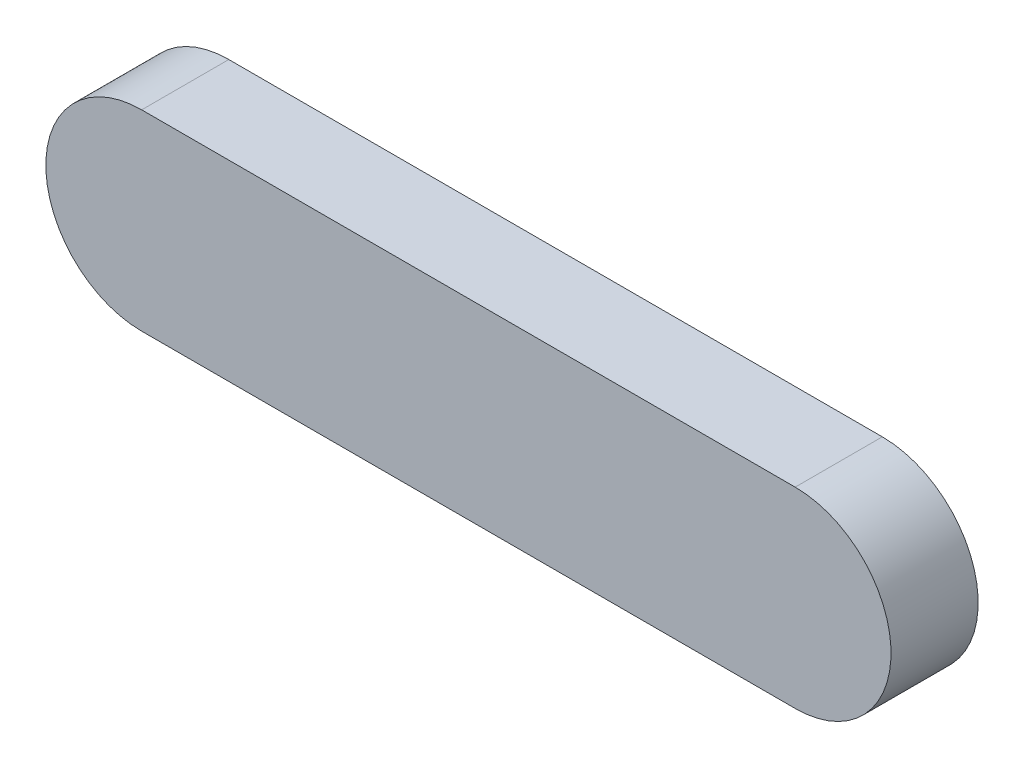
ISO-10303-21;
HEADER;
FILE_DESCRIPTION(('STEP AP214'),'2;1');
FILE_NAME('part.step','',(''),(''),'','','');
FILE_SCHEMA(('AUTOMOTIVE_DESIGN { 1 0 10303 214 1 1 1 1 }'));
ENDSEC;
DATA;
#1=APPLICATION_CONTEXT('core data for automotive mechanical design processes');
#2=APPLICATION_PROTOCOL_DEFINITION('international standard','automotive_design',2000,#1);
#3=PRODUCT_CONTEXT('',#1,'mechanical');
#4=PRODUCT('Part','Part','',(#3));
#5=PRODUCT_RELATED_PRODUCT_CATEGORY('part','',(#4));
#6=PRODUCT_DEFINITION_FORMATION('','',#4);
#7=PRODUCT_DEFINITION_CONTEXT('part definition',#1,'design');
#8=PRODUCT_DEFINITION('design','',#6,#7);
#9=PRODUCT_DEFINITION_SHAPE('','',#8);
#10=(LENGTH_UNIT() NAMED_UNIT(*) SI_UNIT(.MILLI.,.METRE.));
#11=(NAMED_UNIT(*) PLANE_ANGLE_UNIT() SI_UNIT($,.RADIAN.));
#12=(NAMED_UNIT(*) SI_UNIT($,.STERADIAN.) SOLID_ANGLE_UNIT());
#13=UNCERTAINTY_MEASURE_WITH_UNIT(LENGTH_MEASURE(1.E-05),#10,'distance_accuracy_value','');
#14=(GEOMETRIC_REPRESENTATION_CONTEXT(3) GLOBAL_UNCERTAINTY_ASSIGNED_CONTEXT((#13)) GLOBAL_UNIT_ASSIGNED_CONTEXT((#10,
#11,#12)) REPRESENTATION_CONTEXT('',''));
#15=CARTESIAN_POINT('',(0.,0.,0.));
#16=DIRECTION('',(0.,0.,1.));
#17=DIRECTION('',(1.,0.,0.));
#18=AXIS2_PLACEMENT_3D('',#15,#16,#17);
#19=CARTESIAN_POINT('',(20.,50.,10.));
#20=DIRECTION('',(0.,0.,-1.));
#21=DIRECTION('',(-1.,0.,0.));
#22=AXIS2_PLACEMENT_3D('',#19,#20,#21);
#23=CYLINDRICAL_SURFACE('',#22,11.);
#24=CARTESIAN_POINT('',(20.,50.,0.));
#25=DIRECTION('',(0.,0.,1.));
#26=DIRECTION('',(1.,0.,0.));
#27=AXIS2_PLACEMENT_3D('',#24,#25,#26);
#28=CIRCLE('',#27,11.);
#29=CARTESIAN_POINT('',(20.,61.,0.));
#30=VERTEX_POINT('',#29);
#31=CARTESIAN_POINT('',(20.,39.,0.));
#32=VERTEX_POINT('',#31);
#33=EDGE_CURVE('E104',#30,#32,#28,.T.);
#34=ORIENTED_EDGE('',*,*,#33,.T.);
#35=DIRECTION('',(0.,0.,-1.));
#36=VECTOR('',#35,1.);
#37=CARTESIAN_POINT('',(20.,39.,10.));
#38=LINE('',#37,#36);
#39=CARTESIAN_POINT('',(20.,39.,10.));
#40=VERTEX_POINT('',#39);
#41=EDGE_CURVE('E11',#40,#32,#38,.T.);
#42=ORIENTED_EDGE('',*,*,#41,.F.);
#43=CARTESIAN_POINT('',(20.,50.,10.));
#44=DIRECTION('',(0.,0.,1.));
#45=DIRECTION('',(1.,0.,0.));
#46=AXIS2_PLACEMENT_3D('',#43,#44,#45);
#47=CIRCLE('',#46,11.);
#48=CARTESIAN_POINT('',(20.,61.,10.));
#49=VERTEX_POINT('',#48);
#50=EDGE_CURVE('E92',#49,#40,#47,.T.);
#51=ORIENTED_EDGE('',*,*,#50,.F.);
#52=DIRECTION('',(0.,0.,-1.));
#53=VECTOR('',#52,1.);
#54=CARTESIAN_POINT('',(20.,61.,10.));
#55=LINE('',#54,#53);
#56=EDGE_CURVE('E100',#49,#30,#55,.T.);
#57=ORIENTED_EDGE('',*,*,#56,.T.);
#58=EDGE_LOOP('',(#34,#42,#51,#57));
#59=FACE_BOUND('',#58,.T.);
#60=ADVANCED_FACE('F41',(#59),#23,.T.);
#61=CARTESIAN_POINT('',(20.,39.,10.));
#62=DIRECTION('',(0.,1.,0.));
#63=DIRECTION('',(0.,0.,1.));
#64=AXIS2_PLACEMENT_3D('',#61,#62,#63);
#65=PLANE('',#64);
#66=DIRECTION('',(1.,0.,0.));
#67=VECTOR('',#66,1.);
#68=CARTESIAN_POINT('',(20.,39.,0.));
#69=LINE('',#68,#67);
#70=CARTESIAN_POINT('',(95.,39.,0.));
#71=VERTEX_POINT('',#70);
#72=EDGE_CURVE('E96',#32,#71,#69,.T.);
#73=ORIENTED_EDGE('',*,*,#72,.T.);
#74=DIRECTION('',(0.,0.,-1.));
#75=VECTOR('',#74,1.);
#76=CARTESIAN_POINT('',(95.,39.,10.));
#77=LINE('',#76,#75);
#78=CARTESIAN_POINT('',(95.,39.,10.));
#79=VERTEX_POINT('',#78);
#80=EDGE_CURVE('E49',#79,#71,#77,.T.);
#81=ORIENTED_EDGE('',*,*,#80,.F.);
#82=DIRECTION('',(1.,0.,0.));
#83=VECTOR('',#82,1.);
#84=CARTESIAN_POINT('',(20.,39.,10.));
#85=LINE('',#84,#83);
#86=EDGE_CURVE('E87',#40,#79,#85,.T.);
#87=ORIENTED_EDGE('',*,*,#86,.F.);
#88=ORIENTED_EDGE('',*,*,#41,.T.);
#89=EDGE_LOOP('',(#73,#81,#87,#88));
#90=FACE_BOUND('',#89,.T.);
#91=ADVANCED_FACE('F95',(#90),#65,.F.);
#92=CARTESIAN_POINT('',(95.,50.,10.));
#93=DIRECTION('',(0.,0.,-1.));
#94=DIRECTION('',(-1.,0.,0.));
#95=AXIS2_PLACEMENT_3D('',#92,#93,#94);
#96=CYLINDRICAL_SURFACE('',#95,11.);
#97=CARTESIAN_POINT('',(95.,50.,0.));
#98=DIRECTION('',(0.,0.,1.));
#99=DIRECTION('',(1.,0.,0.));
#100=AXIS2_PLACEMENT_3D('',#97,#98,#99);
#101=CIRCLE('',#100,11.);
#102=CARTESIAN_POINT('',(95.,61.,0.));
#103=VERTEX_POINT('',#102);
#104=EDGE_CURVE('E74',#71,#103,#101,.T.);
#105=ORIENTED_EDGE('',*,*,#104,.T.);
#106=DIRECTION('',(0.,0.,-1.));
#107=VECTOR('',#106,1.);
#108=CARTESIAN_POINT('',(95.,61.,10.));
#109=LINE('',#108,#107);
#110=CARTESIAN_POINT('',(95.,61.,10.));
#111=VERTEX_POINT('',#110);
#112=EDGE_CURVE('E97',#111,#103,#109,.T.);
#113=ORIENTED_EDGE('',*,*,#112,.F.);
#114=CARTESIAN_POINT('',(95.,50.,10.));
#115=DIRECTION('',(0.,0.,1.));
#116=DIRECTION('',(1.,0.,0.));
#117=AXIS2_PLACEMENT_3D('',#114,#115,#116);
#118=CIRCLE('',#117,11.);
#119=EDGE_CURVE('E90',#79,#111,#118,.T.);
#120=ORIENTED_EDGE('',*,*,#119,.F.);
#121=ORIENTED_EDGE('',*,*,#80,.T.);
#122=EDGE_LOOP('',(#105,#113,#120,#121));
#123=FACE_BOUND('',#122,.T.);
#124=ADVANCED_FACE('F98',(#123),#96,.T.);
#125=CARTESIAN_POINT('',(20.,61.,10.));
#126=DIRECTION('',(0.,-1.,0.));
#127=DIRECTION('',(0.,0.,-1.));
#128=AXIS2_PLACEMENT_3D('',#125,#126,#127);
#129=PLANE('',#128);
#130=DIRECTION('',(-1.,0.,0.));
#131=VECTOR('',#130,1.);
#132=CARTESIAN_POINT('',(20.,61.,0.));
#133=LINE('',#132,#131);
#134=EDGE_CURVE('E80',#103,#30,#133,.T.);
#135=ORIENTED_EDGE('',*,*,#134,.T.);
#136=ORIENTED_EDGE('',*,*,#56,.F.);
#137=DIRECTION('',(-1.,0.,0.));
#138=VECTOR('',#137,1.);
#139=CARTESIAN_POINT('',(20.,61.,10.));
#140=LINE('',#139,#138);
#141=EDGE_CURVE('E57',#111,#49,#140,.T.);
#142=ORIENTED_EDGE('',*,*,#141,.F.);
#143=ORIENTED_EDGE('',*,*,#112,.T.);
#144=EDGE_LOOP('',(#135,#136,#142,#143));
#145=FACE_BOUND('',#144,.T.);
#146=ADVANCED_FACE('F111',(#145),#129,.F.);
#147=CARTESIAN_POINT('',(20.,50.,10.));
#148=DIRECTION('',(0.,0.,1.));
#149=DIRECTION('',(1.,0.,0.));
#150=AXIS2_PLACEMENT_3D('',#147,#148,#149);
#151=PLANE('',#150);
#152=ORIENTED_EDGE('',*,*,#50,.T.);
#153=ORIENTED_EDGE('',*,*,#86,.T.);
#154=ORIENTED_EDGE('',*,*,#119,.T.);
#155=ORIENTED_EDGE('',*,*,#141,.T.);
#156=EDGE_LOOP('',(#152,#153,#154,#155));
#157=FACE_BOUND('',#156,.T.);
#158=ADVANCED_FACE('F88',(#157),#151,.T.);
#159=CARTESIAN_POINT('',(20.,50.,0.));
#160=DIRECTION('',(0.,0.,1.));
#161=DIRECTION('',(1.,0.,0.));
#162=AXIS2_PLACEMENT_3D('',#159,#160,#161);
#163=PLANE('',#162);
#164=ORIENTED_EDGE('',*,*,#33,.F.);
#165=ORIENTED_EDGE('',*,*,#134,.F.);
#166=ORIENTED_EDGE('',*,*,#104,.F.);
#167=ORIENTED_EDGE('',*,*,#72,.F.);
#168=EDGE_LOOP('',(#164,#165,#166,#167));
#169=FACE_BOUND('',#168,.T.);
#170=ADVANCED_FACE('F114',(#169),#163,.F.);
#171=CLOSED_SHELL('',(#60,#91,#124,#146,#158,#170));
#172=MANIFOLD_SOLID_BREP('B2',#171);
#173=ADVANCED_BREP_SHAPE_REPRESENTATION('',(#18,#172),#14);
#174=SHAPE_DEFINITION_REPRESENTATION(#9,#173);
ENDSEC;
END-ISO-10303-21;
